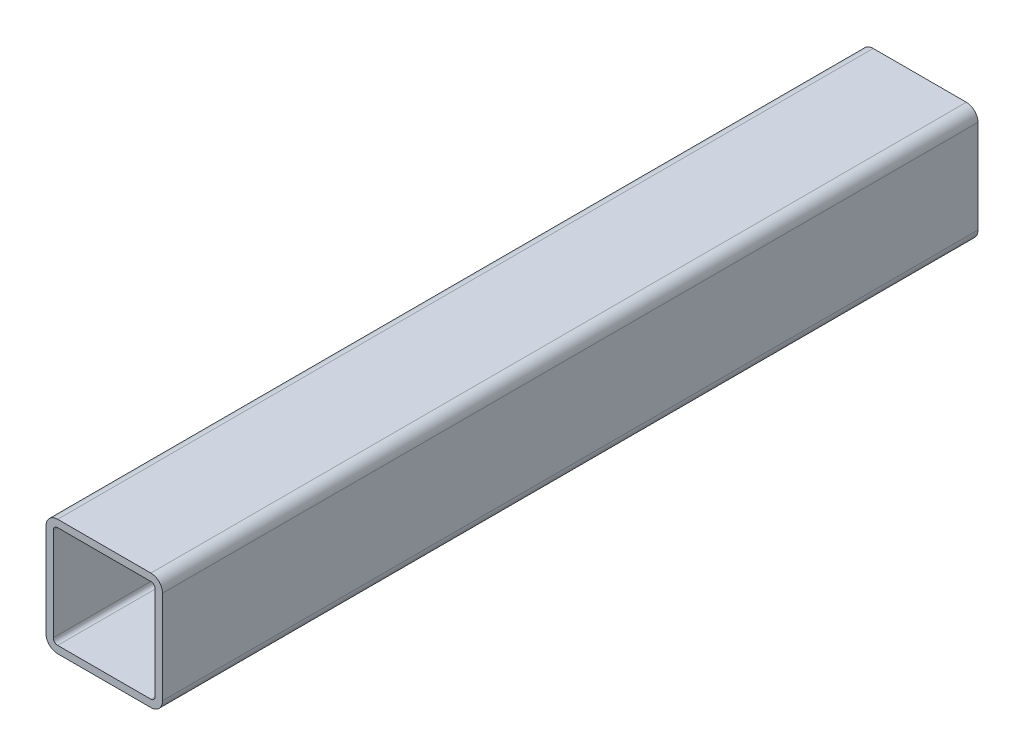
ISO-10303-21;
HEADER;
FILE_DESCRIPTION(('STEP AP214'),'2;1');
FILE_NAME('part.step','',(''),(''),'','','');
FILE_SCHEMA(('AUTOMOTIVE_DESIGN { 1 0 10303 214 1 1 1 1 }'));
ENDSEC;
DATA;
#1=APPLICATION_CONTEXT('core data for automotive mechanical design processes');
#2=APPLICATION_PROTOCOL_DEFINITION('international standard','automotive_design',2000,#1);
#3=PRODUCT_CONTEXT('',#1,'mechanical');
#4=PRODUCT('Part','Part','',(#3));
#5=PRODUCT_RELATED_PRODUCT_CATEGORY('part','',(#4));
#6=PRODUCT_DEFINITION_FORMATION('','',#4);
#7=PRODUCT_DEFINITION_CONTEXT('part definition',#1,'design');
#8=PRODUCT_DEFINITION('design','',#6,#7);
#9=PRODUCT_DEFINITION_SHAPE('','',#8);
#10=(LENGTH_UNIT() NAMED_UNIT(*) SI_UNIT(.MILLI.,.METRE.));
#11=(NAMED_UNIT(*) PLANE_ANGLE_UNIT() SI_UNIT($,.RADIAN.));
#12=(NAMED_UNIT(*) SI_UNIT($,.STERADIAN.) SOLID_ANGLE_UNIT());
#13=UNCERTAINTY_MEASURE_WITH_UNIT(LENGTH_MEASURE(1.E-05),#10,'distance_accuracy_value','');
#14=(GEOMETRIC_REPRESENTATION_CONTEXT(3) GLOBAL_UNCERTAINTY_ASSIGNED_CONTEXT((#13)) GLOBAL_UNIT_ASSIGNED_CONTEXT((#10,
#11,#12)) REPRESENTATION_CONTEXT('',''));
#15=CARTESIAN_POINT('',(0.,0.,0.));
#16=DIRECTION('',(0.,0.,1.));
#17=DIRECTION('',(1.,0.,0.));
#18=AXIS2_PLACEMENT_3D('',#15,#16,#17);
#19=CARTESIAN_POINT('',(207.,7.99999999999979,0.));
#20=DIRECTION('',(0.,0.,-1.));
#21=DIRECTION('',(-1.,0.,0.));
#22=AXIS2_PLACEMENT_3D('',#19,#20,#21);
#23=PLANE('',#22);
#24=CARTESIAN_POINT('',(207.,7.99999999999979,0.));
#25=DIRECTION('',(0.,0.,1.));
#26=DIRECTION('',(-1.,0.,0.));
#27=AXIS2_PLACEMENT_3D('',#24,#25,#26);
#28=CIRCLE('',#27,8.);
#29=CARTESIAN_POINT('',(207.,-2.15105711021124E-13,0.));
#30=VERTEX_POINT('',#29);
#31=CARTESIAN_POINT('',(215.,7.99999999999979,0.));
#32=VERTEX_POINT('',#31);
#33=EDGE_CURVE('E177',#30,#32,#28,.T.);
#34=ORIENTED_EDGE('',*,*,#33,.F.);
#35=DIRECTION('',(1.,0.,0.));
#36=VECTOR('',#35,1.);
#37=CARTESIAN_POINT('',(143.,-2.15105711021124E-13,0.));
#38=LINE('',#37,#36);
#39=CARTESIAN_POINT('',(143.,-2.18575157973078E-13,0.));
#40=VERTEX_POINT('',#39);
#41=EDGE_CURVE('E130',#40,#30,#38,.T.);
#42=ORIENTED_EDGE('',*,*,#41,.F.);
#43=CARTESIAN_POINT('',(143.,7.99999999999979,0.));
#44=DIRECTION('',(0.,0.,1.));
#45=DIRECTION('',(1.,0.,0.));
#46=AXIS2_PLACEMENT_3D('',#43,#44,#45);
#47=CIRCLE('',#46,8.);
#48=CARTESIAN_POINT('',(135.,7.99999999999979,0.));
#49=VERTEX_POINT('',#48);
#50=EDGE_CURVE('E171',#49,#40,#47,.T.);
#51=ORIENTED_EDGE('',*,*,#50,.F.);
#52=DIRECTION('',(0.,-1.,0.));
#53=VECTOR('',#52,1.);
#54=CARTESIAN_POINT('',(135.,7.99999999999979,0.));
#55=LINE('',#54,#53);
#56=CARTESIAN_POINT('',(135.,71.9999999999998,0.));
#57=VERTEX_POINT('',#56);
#58=EDGE_CURVE('E167',#57,#49,#55,.T.);
#59=ORIENTED_EDGE('',*,*,#58,.F.);
#60=CARTESIAN_POINT('',(143.,71.9999999999998,0.));
#61=DIRECTION('',(0.,0.,1.));
#62=DIRECTION('',(1.,0.,0.));
#63=AXIS2_PLACEMENT_3D('',#60,#61,#62);
#64=CIRCLE('',#63,8.00000000000001);
#65=CARTESIAN_POINT('',(143.,79.9999999999998,0.));
#66=VERTEX_POINT('',#65);
#67=EDGE_CURVE('E163',#66,#57,#64,.T.);
#68=ORIENTED_EDGE('',*,*,#67,.F.);
#69=DIRECTION('',(-1.,0.,0.));
#70=VECTOR('',#69,1.);
#71=CARTESIAN_POINT('',(143.,79.9999999999998,0.));
#72=LINE('',#71,#70);
#73=CARTESIAN_POINT('',(207.,79.9999999999998,0.));
#74=VERTEX_POINT('',#73);
#75=EDGE_CURVE('E159',#74,#66,#72,.T.);
#76=ORIENTED_EDGE('',*,*,#75,.F.);
#77=CARTESIAN_POINT('',(207.,71.9999999999998,0.));
#78=DIRECTION('',(0.,0.,1.));
#79=DIRECTION('',(1.,0.,0.));
#80=AXIS2_PLACEMENT_3D('',#77,#78,#79);
#81=CIRCLE('',#80,8.00000000000001);
#82=CARTESIAN_POINT('',(215.,71.9999999999998,0.));
#83=VERTEX_POINT('',#82);
#84=EDGE_CURVE('E155',#83,#74,#81,.T.);
#85=ORIENTED_EDGE('',*,*,#84,.F.);
#86=DIRECTION('',(0.,1.,0.));
#87=VECTOR('',#86,1.);
#88=CARTESIAN_POINT('',(215.,7.99999999999979,0.));
#89=LINE('',#88,#87);
#90=EDGE_CURVE('E151',#32,#83,#89,.T.);
#91=ORIENTED_EDGE('',*,*,#90,.F.);
#92=EDGE_LOOP('',(#34,#42,#51,#59,#68,#76,#85,#91));
#93=FACE_BOUND('',#92,.T.);
#94=DIRECTION('',(0.,-1.,0.));
#95=VECTOR('',#94,1.);
#96=CARTESIAN_POINT('',(140.,7.99999999999979,0.));
#97=LINE('',#96,#95);
#98=CARTESIAN_POINT('',(140.,71.9999999999998,0.));
#99=VERTEX_POINT('',#98);
#100=CARTESIAN_POINT('',(140.,7.99999999999979,0.));
#101=VERTEX_POINT('',#100);
#102=EDGE_CURVE('E141',#99,#101,#97,.T.);
#103=ORIENTED_EDGE('',*,*,#102,.T.);
#104=CARTESIAN_POINT('',(143.,7.99999999999979,0.));
#105=DIRECTION('',(0.,0.,1.));
#106=DIRECTION('',(1.,0.,0.));
#107=AXIS2_PLACEMENT_3D('',#104,#105,#106);
#108=CIRCLE('',#107,3.);
#109=CARTESIAN_POINT('',(143.,4.99999999999979,0.));
#110=VERTEX_POINT('',#109);
#111=EDGE_CURVE('E126',#101,#110,#108,.T.);
#112=ORIENTED_EDGE('',*,*,#111,.T.);
#113=DIRECTION('',(1.,0.,0.));
#114=VECTOR('',#113,1.);
#115=CARTESIAN_POINT('',(143.,4.99999999999979,0.));
#116=LINE('',#115,#114);
#117=CARTESIAN_POINT('',(207.,4.99999999999978,0.));
#118=VERTEX_POINT('',#117);
#119=EDGE_CURVE('E133',#110,#118,#116,.T.);
#120=ORIENTED_EDGE('',*,*,#119,.T.);
#121=CARTESIAN_POINT('',(207.,7.99999999999979,0.));
#122=DIRECTION('',(0.,0.,1.));
#123=DIRECTION('',(-1.,0.,0.));
#124=AXIS2_PLACEMENT_3D('',#121,#122,#123);
#125=CIRCLE('',#124,3.);
#126=CARTESIAN_POINT('',(210.,7.99999999999979,0.));
#127=VERTEX_POINT('',#126);
#128=EDGE_CURVE('E137',#118,#127,#125,.T.);
#129=ORIENTED_EDGE('',*,*,#128,.T.);
#130=DIRECTION('',(0.,1.,0.));
#131=VECTOR('',#130,1.);
#132=CARTESIAN_POINT('',(210.,7.99999999999979,0.));
#133=LINE('',#132,#131);
#134=CARTESIAN_POINT('',(210.,71.9999999999998,0.));
#135=VERTEX_POINT('',#134);
#136=EDGE_CURVE('E243',#127,#135,#133,.T.);
#137=ORIENTED_EDGE('',*,*,#136,.T.);
#138=CARTESIAN_POINT('',(207.,71.9999999999998,0.));
#139=DIRECTION('',(0.,0.,1.));
#140=DIRECTION('',(1.,0.,0.));
#141=AXIS2_PLACEMENT_3D('',#138,#139,#140);
#142=CIRCLE('',#141,3.);
#143=CARTESIAN_POINT('',(207.,74.9999999999998,0.));
#144=VERTEX_POINT('',#143);
#145=EDGE_CURVE('E241',#135,#144,#142,.T.);
#146=ORIENTED_EDGE('',*,*,#145,.T.);
#147=DIRECTION('',(-1.,0.,0.));
#148=VECTOR('',#147,1.);
#149=CARTESIAN_POINT('',(143.,74.9999999999998,0.));
#150=LINE('',#149,#148);
#151=CARTESIAN_POINT('',(143.,74.9999999999998,0.));
#152=VERTEX_POINT('',#151);
#153=EDGE_CURVE('E236',#144,#152,#150,.T.);
#154=ORIENTED_EDGE('',*,*,#153,.T.);
#155=CARTESIAN_POINT('',(143.,71.9999999999998,0.));
#156=DIRECTION('',(0.,0.,1.));
#157=DIRECTION('',(1.,0.,0.));
#158=AXIS2_PLACEMENT_3D('',#155,#156,#157);
#159=CIRCLE('',#158,3.);
#160=EDGE_CURVE('E193',#152,#99,#159,.T.);
#161=ORIENTED_EDGE('',*,*,#160,.T.);
#162=EDGE_LOOP('',(#103,#112,#120,#129,#137,#146,#154,#161));
#163=FACE_BOUND('',#162,.T.);
#164=ADVANCED_FACE('F35',(#93,#163),#23,.T.);
#165=CARTESIAN_POINT('',(207.,7.99999999999979,673.137084989847));
#166=DIRECTION('',(0.,0.,-1.));
#167=DIRECTION('',(-1.,0.,0.));
#168=AXIS2_PLACEMENT_3D('',#165,#166,#167);
#169=CYLINDRICAL_SURFACE('',#168,8.);
#170=DIRECTION('',(0.,0.,-1.));
#171=VECTOR('',#170,1.);
#172=CARTESIAN_POINT('',(215.,7.99999999999979,673.137084989847));
#173=LINE('',#172,#171);
#174=CARTESIAN_POINT('',(215.,7.99999999999979,560.));
#175=VERTEX_POINT('',#174);
#176=EDGE_CURVE('E149',#175,#32,#173,.T.);
#177=ORIENTED_EDGE('',*,*,#176,.F.);
#178=CARTESIAN_POINT('',(207.,7.99999999999979,560.));
#179=DIRECTION('',(0.,0.,-1.));
#180=DIRECTION('',(-1.,0.,0.));
#181=AXIS2_PLACEMENT_3D('',#178,#179,#180);
#182=CIRCLE('',#181,8.);
#183=CARTESIAN_POINT('',(207.,-2.15105711021124E-13,560.));
#184=VERTEX_POINT('',#183);
#185=EDGE_CURVE('E54',#175,#184,#182,.T.);
#186=ORIENTED_EDGE('',*,*,#185,.T.);
#187=DIRECTION('',(0.,0.,-1.));
#188=VECTOR('',#187,1.);
#189=CARTESIAN_POINT('',(207.,-2.15105711021124E-13,673.137084989847));
#190=LINE('',#189,#188);
#191=EDGE_CURVE('E176',#184,#30,#190,.T.);
#192=ORIENTED_EDGE('',*,*,#191,.T.);
#193=ORIENTED_EDGE('',*,*,#33,.T.);
#194=EDGE_LOOP('',(#177,#186,#192,#193));
#195=FACE_BOUND('',#194,.T.);
#196=ADVANCED_FACE('F311',(#195),#169,.T.);
#197=CARTESIAN_POINT('',(215.,7.99999999999979,673.137084989847));
#198=DIRECTION('',(-1.,0.,0.));
#199=DIRECTION('',(0.,0.,1.));
#200=AXIS2_PLACEMENT_3D('',#197,#198,#199);
#201=PLANE('',#200);
#202=DIRECTION('',(0.,0.,-1.));
#203=VECTOR('',#202,1.);
#204=CARTESIAN_POINT('',(215.,71.9999999999998,673.137084989847));
#205=LINE('',#204,#203);
#206=CARTESIAN_POINT('',(215.,71.9999999999998,560.));
#207=VERTEX_POINT('',#206);
#208=EDGE_CURVE('E153',#207,#83,#205,.T.);
#209=ORIENTED_EDGE('',*,*,#208,.F.);
#210=DIRECTION('',(0.,-1.,0.));
#211=VECTOR('',#210,1.);
#212=CARTESIAN_POINT('',(215.,7.99999999999978,560.));
#213=LINE('',#212,#211);
#214=EDGE_CURVE('E152',#207,#175,#213,.T.);
#215=ORIENTED_EDGE('',*,*,#214,.T.);
#216=ORIENTED_EDGE('',*,*,#176,.T.);
#217=ORIENTED_EDGE('',*,*,#90,.T.);
#218=EDGE_LOOP('',(#209,#215,#216,#217));
#219=FACE_BOUND('',#218,.T.);
#220=ADVANCED_FACE('F282',(#219),#201,.F.);
#221=CARTESIAN_POINT('',(207.,71.9999999999998,673.137084989847));
#222=DIRECTION('',(0.,0.,-1.));
#223=DIRECTION('',(-1.,0.,0.));
#224=AXIS2_PLACEMENT_3D('',#221,#222,#223);
#225=CYLINDRICAL_SURFACE('',#224,8.00000000000001);
#226=DIRECTION('',(0.,0.,-1.));
#227=VECTOR('',#226,1.);
#228=CARTESIAN_POINT('',(207.,79.9999999999998,673.137084989847));
#229=LINE('',#228,#227);
#230=CARTESIAN_POINT('',(207.,79.9999999999998,560.));
#231=VERTEX_POINT('',#230);
#232=EDGE_CURVE('E157',#231,#74,#229,.T.);
#233=ORIENTED_EDGE('',*,*,#232,.F.);
#234=CARTESIAN_POINT('',(207.,71.9999999999998,560.));
#235=DIRECTION('',(0.,0.,-1.));
#236=DIRECTION('',(-1.,0.,0.));
#237=AXIS2_PLACEMENT_3D('',#234,#235,#236);
#238=CIRCLE('',#237,8.00000000000001);
#239=EDGE_CURVE('E156',#231,#207,#238,.T.);
#240=ORIENTED_EDGE('',*,*,#239,.T.);
#241=ORIENTED_EDGE('',*,*,#208,.T.);
#242=ORIENTED_EDGE('',*,*,#84,.T.);
#243=EDGE_LOOP('',(#233,#240,#241,#242));
#244=FACE_BOUND('',#243,.T.);
#245=ADVANCED_FACE('F287',(#244),#225,.T.);
#246=CARTESIAN_POINT('',(143.,79.9999999999998,673.137084989847));
#247=DIRECTION('',(0.,-1.,0.));
#248=DIRECTION('',(0.,0.,-1.));
#249=AXIS2_PLACEMENT_3D('',#246,#247,#248);
#250=PLANE('',#249);
#251=DIRECTION('',(0.,0.,-1.));
#252=VECTOR('',#251,1.);
#253=CARTESIAN_POINT('',(143.,79.9999999999998,673.137084989847));
#254=LINE('',#253,#252);
#255=CARTESIAN_POINT('',(143.,79.9999999999998,560.));
#256=VERTEX_POINT('',#255);
#257=EDGE_CURVE('E161',#256,#66,#254,.T.);
#258=ORIENTED_EDGE('',*,*,#257,.F.);
#259=DIRECTION('',(1.,0.,0.));
#260=VECTOR('',#259,1.);
#261=CARTESIAN_POINT('',(143.,79.9999999999998,560.));
#262=LINE('',#261,#260);
#263=EDGE_CURVE('E160',#256,#231,#262,.T.);
#264=ORIENTED_EDGE('',*,*,#263,.T.);
#265=ORIENTED_EDGE('',*,*,#232,.T.);
#266=ORIENTED_EDGE('',*,*,#75,.T.);
#267=EDGE_LOOP('',(#258,#264,#265,#266));
#268=FACE_BOUND('',#267,.T.);
#269=ADVANCED_FACE('F292',(#268),#250,.F.);
#270=CARTESIAN_POINT('',(143.,71.9999999999998,673.137084989847));
#271=DIRECTION('',(0.,0.,-1.));
#272=DIRECTION('',(-1.,0.,0.));
#273=AXIS2_PLACEMENT_3D('',#270,#271,#272);
#274=CYLINDRICAL_SURFACE('',#273,8.00000000000001);
#275=DIRECTION('',(0.,0.,-1.));
#276=VECTOR('',#275,1.);
#277=CARTESIAN_POINT('',(135.,71.9999999999998,673.137084989847));
#278=LINE('',#277,#276);
#279=CARTESIAN_POINT('',(135.,71.9999999999998,560.));
#280=VERTEX_POINT('',#279);
#281=EDGE_CURVE('E165',#280,#57,#278,.T.);
#282=ORIENTED_EDGE('',*,*,#281,.F.);
#283=CARTESIAN_POINT('',(143.,71.9999999999998,560.));
#284=DIRECTION('',(0.,0.,-1.));
#285=DIRECTION('',(-1.,0.,0.));
#286=AXIS2_PLACEMENT_3D('',#283,#284,#285);
#287=CIRCLE('',#286,8.00000000000001);
#288=EDGE_CURVE('E164',#280,#256,#287,.T.);
#289=ORIENTED_EDGE('',*,*,#288,.T.);
#290=ORIENTED_EDGE('',*,*,#257,.T.);
#291=ORIENTED_EDGE('',*,*,#67,.T.);
#292=EDGE_LOOP('',(#282,#289,#290,#291));
#293=FACE_BOUND('',#292,.T.);
#294=ADVANCED_FACE('F297',(#293),#274,.T.);
#295=CARTESIAN_POINT('',(135.,7.99999999999979,673.137084989847));
#296=DIRECTION('',(1.,0.,0.));
#297=DIRECTION('',(0.,0.,-1.));
#298=AXIS2_PLACEMENT_3D('',#295,#296,#297);
#299=PLANE('',#298);
#300=DIRECTION('',(0.,0.,-1.));
#301=VECTOR('',#300,1.);
#302=CARTESIAN_POINT('',(135.,7.99999999999979,673.137084989847));
#303=LINE('',#302,#301);
#304=CARTESIAN_POINT('',(135.,7.99999999999979,560.));
#305=VERTEX_POINT('',#304);
#306=EDGE_CURVE('E169',#305,#49,#303,.T.);
#307=ORIENTED_EDGE('',*,*,#306,.F.);
#308=DIRECTION('',(0.,1.,0.));
#309=VECTOR('',#308,1.);
#310=CARTESIAN_POINT('',(135.,7.99999999999978,560.));
#311=LINE('',#310,#309);
#312=EDGE_CURVE('E168',#305,#280,#311,.T.);
#313=ORIENTED_EDGE('',*,*,#312,.T.);
#314=ORIENTED_EDGE('',*,*,#281,.T.);
#315=ORIENTED_EDGE('',*,*,#58,.T.);
#316=EDGE_LOOP('',(#307,#313,#314,#315));
#317=FACE_BOUND('',#316,.T.);
#318=ADVANCED_FACE('F302',(#317),#299,.F.);
#319=CARTESIAN_POINT('',(143.,7.99999999999979,673.137084989847));
#320=DIRECTION('',(0.,0.,-1.));
#321=DIRECTION('',(-1.,0.,0.));
#322=AXIS2_PLACEMENT_3D('',#319,#320,#321);
#323=CYLINDRICAL_SURFACE('',#322,8.);
#324=DIRECTION('',(0.,0.,-1.));
#325=VECTOR('',#324,1.);
#326=CARTESIAN_POINT('',(143.,-2.18575157973078E-13,673.137084989847));
#327=LINE('',#326,#325);
#328=CARTESIAN_POINT('',(143.,-2.18575157973078E-13,560.));
#329=VERTEX_POINT('',#328);
#330=EDGE_CURVE('E173',#329,#40,#327,.T.);
#331=ORIENTED_EDGE('',*,*,#330,.F.);
#332=CARTESIAN_POINT('',(143.,7.99999999999979,560.));
#333=DIRECTION('',(0.,0.,-1.));
#334=DIRECTION('',(-1.,0.,0.));
#335=AXIS2_PLACEMENT_3D('',#332,#333,#334);
#336=CIRCLE('',#335,8.);
#337=EDGE_CURVE('E172',#329,#305,#336,.T.);
#338=ORIENTED_EDGE('',*,*,#337,.T.);
#339=ORIENTED_EDGE('',*,*,#306,.T.);
#340=ORIENTED_EDGE('',*,*,#50,.T.);
#341=EDGE_LOOP('',(#331,#338,#339,#340));
#342=FACE_BOUND('',#341,.T.);
#343=ADVANCED_FACE('F307',(#342),#323,.T.);
#344=CARTESIAN_POINT('',(143.,-2.15105711021124E-13,673.137084989847));
#345=DIRECTION('',(0.,1.,0.));
#346=DIRECTION('',(0.,0.,1.));
#347=AXIS2_PLACEMENT_3D('',#344,#345,#346);
#348=PLANE('',#347);
#349=ORIENTED_EDGE('',*,*,#191,.F.);
#350=DIRECTION('',(-1.,0.,0.));
#351=VECTOR('',#350,1.);
#352=CARTESIAN_POINT('',(143.,-2.15105711021124E-13,560.));
#353=LINE('',#352,#351);
#354=EDGE_CURVE('E175',#184,#329,#353,.T.);
#355=ORIENTED_EDGE('',*,*,#354,.T.);
#356=ORIENTED_EDGE('',*,*,#330,.T.);
#357=ORIENTED_EDGE('',*,*,#41,.T.);
#358=EDGE_LOOP('',(#349,#355,#356,#357));
#359=FACE_BOUND('',#358,.T.);
#360=ADVANCED_FACE('F314',(#359),#348,.F.);
#361=CARTESIAN_POINT('',(143.,7.99999999999979,673.137084989847));
#362=DIRECTION('',(0.,0.,-1.));
#363=DIRECTION('',(-1.,0.,0.));
#364=AXIS2_PLACEMENT_3D('',#361,#362,#363);
#365=CYLINDRICAL_SURFACE('',#364,3.);
#366=CARTESIAN_POINT('',(143.,7.99999999999979,560.));
#367=DIRECTION('',(0.,0.,-1.));
#368=DIRECTION('',(-1.,0.,0.));
#369=AXIS2_PLACEMENT_3D('',#366,#367,#368);
#370=CIRCLE('',#369,3.);
#371=CARTESIAN_POINT('',(143.,4.99999999999979,560.));
#372=VERTEX_POINT('',#371);
#373=CARTESIAN_POINT('',(140.,7.99999999999979,560.));
#374=VERTEX_POINT('',#373);
#375=EDGE_CURVE('E129',#372,#374,#370,.T.);
#376=ORIENTED_EDGE('',*,*,#375,.F.);
#377=DIRECTION('',(0.,0.,-1.));
#378=VECTOR('',#377,1.);
#379=CARTESIAN_POINT('',(143.,4.99999999999979,673.137084989847));
#380=LINE('',#379,#378);
#381=EDGE_CURVE('E122',#372,#110,#380,.T.);
#382=ORIENTED_EDGE('',*,*,#381,.T.);
#383=ORIENTED_EDGE('',*,*,#111,.F.);
#384=DIRECTION('',(0.,0.,-1.));
#385=VECTOR('',#384,1.);
#386=CARTESIAN_POINT('',(140.,7.99999999999979,673.137084989847));
#387=LINE('',#386,#385);
#388=EDGE_CURVE('E190',#374,#101,#387,.T.);
#389=ORIENTED_EDGE('',*,*,#388,.F.);
#390=EDGE_LOOP('',(#376,#382,#383,#389));
#391=FACE_BOUND('',#390,.T.);
#392=ADVANCED_FACE('F123',(#391),#365,.F.);
#393=CARTESIAN_POINT('',(143.,4.99999999999979,673.137084989847));
#394=DIRECTION('',(0.,1.,0.));
#395=DIRECTION('',(0.,0.,1.));
#396=AXIS2_PLACEMENT_3D('',#393,#394,#395);
#397=PLANE('',#396);
#398=DIRECTION('',(-1.,0.,0.));
#399=VECTOR('',#398,1.);
#400=CARTESIAN_POINT('',(143.,4.99999999999979,560.));
#401=LINE('',#400,#399);
#402=CARTESIAN_POINT('',(207.,4.99999999999978,560.));
#403=VERTEX_POINT('',#402);
#404=EDGE_CURVE('E11',#403,#372,#401,.T.);
#405=ORIENTED_EDGE('',*,*,#404,.F.);
#406=DIRECTION('',(0.,0.,-1.));
#407=VECTOR('',#406,1.);
#408=CARTESIAN_POINT('',(207.,4.99999999999978,673.137084989847));
#409=LINE('',#408,#407);
#410=EDGE_CURVE('E115',#403,#118,#409,.T.);
#411=ORIENTED_EDGE('',*,*,#410,.T.);
#412=ORIENTED_EDGE('',*,*,#119,.F.);
#413=ORIENTED_EDGE('',*,*,#381,.F.);
#414=EDGE_LOOP('',(#405,#411,#412,#413));
#415=FACE_BOUND('',#414,.T.);
#416=ADVANCED_FACE('F134',(#415),#397,.T.);
#417=CARTESIAN_POINT('',(207.,7.99999999999979,673.137084989847));
#418=DIRECTION('',(0.,0.,-1.));
#419=DIRECTION('',(-1.,0.,0.));
#420=AXIS2_PLACEMENT_3D('',#417,#418,#419);
#421=CYLINDRICAL_SURFACE('',#420,3.);
#422=CARTESIAN_POINT('',(207.,7.99999999999979,560.));
#423=DIRECTION('',(0.,0.,-1.));
#424=DIRECTION('',(-1.,0.,0.));
#425=AXIS2_PLACEMENT_3D('',#422,#423,#424);
#426=CIRCLE('',#425,3.);
#427=CARTESIAN_POINT('',(210.,7.99999999999979,560.));
#428=VERTEX_POINT('',#427);
#429=EDGE_CURVE('E45',#428,#403,#426,.T.);
#430=ORIENTED_EDGE('',*,*,#429,.F.);
#431=DIRECTION('',(0.,0.,-1.));
#432=VECTOR('',#431,1.);
#433=CARTESIAN_POINT('',(210.,7.99999999999979,673.137084989847));
#434=LINE('',#433,#432);
#435=EDGE_CURVE('E180',#428,#127,#434,.T.);
#436=ORIENTED_EDGE('',*,*,#435,.T.);
#437=ORIENTED_EDGE('',*,*,#128,.F.);
#438=ORIENTED_EDGE('',*,*,#410,.F.);
#439=EDGE_LOOP('',(#430,#436,#437,#438));
#440=FACE_BOUND('',#439,.T.);
#441=ADVANCED_FACE('F249',(#440),#421,.F.);
#442=CARTESIAN_POINT('',(210.,7.99999999999979,673.137084989847));
#443=DIRECTION('',(-1.,0.,0.));
#444=DIRECTION('',(0.,0.,1.));
#445=AXIS2_PLACEMENT_3D('',#442,#443,#444);
#446=PLANE('',#445);
#447=DIRECTION('',(0.,-1.,0.));
#448=VECTOR('',#447,1.);
#449=CARTESIAN_POINT('',(210.,7.99999999999978,560.));
#450=LINE('',#449,#448);
#451=CARTESIAN_POINT('',(210.,71.9999999999998,560.));
#452=VERTEX_POINT('',#451);
#453=EDGE_CURVE('E211',#452,#428,#450,.T.);
#454=ORIENTED_EDGE('',*,*,#453,.F.);
#455=DIRECTION('',(0.,0.,-1.));
#456=VECTOR('',#455,1.);
#457=CARTESIAN_POINT('',(210.,71.9999999999998,673.137084989847));
#458=LINE('',#457,#456);
#459=EDGE_CURVE('E182',#452,#135,#458,.T.);
#460=ORIENTED_EDGE('',*,*,#459,.T.);
#461=ORIENTED_EDGE('',*,*,#136,.F.);
#462=ORIENTED_EDGE('',*,*,#435,.F.);
#463=EDGE_LOOP('',(#454,#460,#461,#462));
#464=FACE_BOUND('',#463,.T.);
#465=ADVANCED_FACE('F255',(#464),#446,.T.);
#466=CARTESIAN_POINT('',(207.,71.9999999999998,673.137084989847));
#467=DIRECTION('',(0.,0.,-1.));
#468=DIRECTION('',(-1.,0.,0.));
#469=AXIS2_PLACEMENT_3D('',#466,#467,#468);
#470=CYLINDRICAL_SURFACE('',#469,3.);
#471=CARTESIAN_POINT('',(207.,71.9999999999998,560.));
#472=DIRECTION('',(0.,0.,-1.));
#473=DIRECTION('',(-1.,0.,0.));
#474=AXIS2_PLACEMENT_3D('',#471,#472,#473);
#475=CIRCLE('',#474,3.);
#476=CARTESIAN_POINT('',(207.,74.9999999999998,560.));
#477=VERTEX_POINT('',#476);
#478=EDGE_CURVE('E214',#477,#452,#475,.T.);
#479=ORIENTED_EDGE('',*,*,#478,.F.);
#480=DIRECTION('',(0.,0.,-1.));
#481=VECTOR('',#480,1.);
#482=CARTESIAN_POINT('',(207.,74.9999999999998,673.137084989847));
#483=LINE('',#482,#481);
#484=EDGE_CURVE('E184',#477,#144,#483,.T.);
#485=ORIENTED_EDGE('',*,*,#484,.T.);
#486=ORIENTED_EDGE('',*,*,#145,.F.);
#487=ORIENTED_EDGE('',*,*,#459,.F.);
#488=EDGE_LOOP('',(#479,#485,#486,#487));
#489=FACE_BOUND('',#488,.T.);
#490=ADVANCED_FACE('F259',(#489),#470,.F.);
#491=CARTESIAN_POINT('',(143.,74.9999999999998,673.137084989847));
#492=DIRECTION('',(0.,-1.,0.));
#493=DIRECTION('',(1.,0.,0.));
#494=AXIS2_PLACEMENT_3D('',#491,#492,#493);
#495=PLANE('',#494);
#496=DIRECTION('',(1.,0.,0.));
#497=VECTOR('',#496,1.);
#498=CARTESIAN_POINT('',(143.,74.9999999999998,560.));
#499=LINE('',#498,#497);
#500=CARTESIAN_POINT('',(143.,74.9999999999998,560.));
#501=VERTEX_POINT('',#500);
#502=EDGE_CURVE('E216',#501,#477,#499,.T.);
#503=ORIENTED_EDGE('',*,*,#502,.F.);
#504=DIRECTION('',(0.,0.,-1.));
#505=VECTOR('',#504,1.);
#506=CARTESIAN_POINT('',(143.,74.9999999999998,673.137084989847));
#507=LINE('',#506,#505);
#508=EDGE_CURVE('E186',#501,#152,#507,.T.);
#509=ORIENTED_EDGE('',*,*,#508,.T.);
#510=ORIENTED_EDGE('',*,*,#153,.F.);
#511=ORIENTED_EDGE('',*,*,#484,.F.);
#512=EDGE_LOOP('',(#503,#509,#510,#511));
#513=FACE_BOUND('',#512,.T.);
#514=ADVANCED_FACE('F231',(#513),#495,.T.);
#515=CARTESIAN_POINT('',(143.,71.9999999999998,673.137084989847));
#516=DIRECTION('',(0.,0.,-1.));
#517=DIRECTION('',(-1.,0.,0.));
#518=AXIS2_PLACEMENT_3D('',#515,#516,#517);
#519=CYLINDRICAL_SURFACE('',#518,3.);
#520=CARTESIAN_POINT('',(143.,71.9999999999998,560.));
#521=DIRECTION('',(0.,0.,-1.));
#522=DIRECTION('',(-1.,0.,0.));
#523=AXIS2_PLACEMENT_3D('',#520,#521,#522);
#524=CIRCLE('',#523,3.);
#525=CARTESIAN_POINT('',(140.,71.9999999999998,560.));
#526=VERTEX_POINT('',#525);
#527=EDGE_CURVE('E39',#526,#501,#524,.T.);
#528=ORIENTED_EDGE('',*,*,#527,.F.);
#529=DIRECTION('',(0.,0.,-1.));
#530=VECTOR('',#529,1.);
#531=CARTESIAN_POINT('',(140.,71.9999999999998,673.137084989847));
#532=LINE('',#531,#530);
#533=EDGE_CURVE('E188',#526,#99,#532,.T.);
#534=ORIENTED_EDGE('',*,*,#533,.T.);
#535=ORIENTED_EDGE('',*,*,#160,.F.);
#536=ORIENTED_EDGE('',*,*,#508,.F.);
#537=EDGE_LOOP('',(#528,#534,#535,#536));
#538=FACE_BOUND('',#537,.T.);
#539=ADVANCED_FACE('F234',(#538),#519,.F.);
#540=CARTESIAN_POINT('',(140.,7.99999999999979,673.137084989847));
#541=DIRECTION('',(1.,0.,0.));
#542=DIRECTION('',(0.,0.,-1.));
#543=AXIS2_PLACEMENT_3D('',#540,#541,#542);
#544=PLANE('',#543);
#545=DIRECTION('',(0.,1.,0.));
#546=VECTOR('',#545,1.);
#547=CARTESIAN_POINT('',(140.,7.99999999999978,560.));
#548=LINE('',#547,#546);
#549=EDGE_CURVE('E146',#374,#526,#548,.T.);
#550=ORIENTED_EDGE('',*,*,#549,.F.);
#551=ORIENTED_EDGE('',*,*,#388,.T.);
#552=ORIENTED_EDGE('',*,*,#102,.F.);
#553=ORIENTED_EDGE('',*,*,#533,.F.);
#554=EDGE_LOOP('',(#550,#551,#552,#553));
#555=FACE_BOUND('',#554,.T.);
#556=ADVANCED_FACE('F347',(#555),#544,.T.);
#557=CARTESIAN_POINT('',(600.,71.9999999999998,559.999999999999));
#558=DIRECTION('',(0.,0.,-1.));
#559=DIRECTION('',(0.,-1.,0.));
#560=AXIS2_PLACEMENT_3D('',#557,#558,#559);
#561=PLANE('',#560);
#562=ORIENTED_EDGE('',*,*,#375,.T.);
#563=ORIENTED_EDGE('',*,*,#549,.T.);
#564=ORIENTED_EDGE('',*,*,#527,.T.);
#565=ORIENTED_EDGE('',*,*,#502,.T.);
#566=ORIENTED_EDGE('',*,*,#478,.T.);
#567=ORIENTED_EDGE('',*,*,#453,.T.);
#568=ORIENTED_EDGE('',*,*,#429,.T.);
#569=ORIENTED_EDGE('',*,*,#404,.T.);
#570=EDGE_LOOP('',(#562,#563,#564,#565,#566,#567,#568,#569));
#571=FACE_BOUND('',#570,.T.);
#572=ORIENTED_EDGE('',*,*,#214,.F.);
#573=ORIENTED_EDGE('',*,*,#239,.F.);
#574=ORIENTED_EDGE('',*,*,#263,.F.);
#575=ORIENTED_EDGE('',*,*,#288,.F.);
#576=ORIENTED_EDGE('',*,*,#312,.F.);
#577=ORIENTED_EDGE('',*,*,#337,.F.);
#578=ORIENTED_EDGE('',*,*,#354,.F.);
#579=ORIENTED_EDGE('',*,*,#185,.F.);
#580=EDGE_LOOP('',(#572,#573,#574,#575,#576,#577,#578,#579));
#581=FACE_BOUND('',#580,.T.);
#582=ADVANCED_FACE('F37',(#571,#581),#561,.F.);
#583=CLOSED_SHELL('',(#164,#196,#220,#245,#269,#294,#318,#343,#360,#392,#416,#441,#465,#490,
#514,#539,#556,#582));
#584=MANIFOLD_SOLID_BREP('B2',#583);
#585=ADVANCED_BREP_SHAPE_REPRESENTATION('',(#18,#584),#14);
#586=SHAPE_DEFINITION_REPRESENTATION(#9,#585);
ENDSEC;
END-ISO-10303-21;
